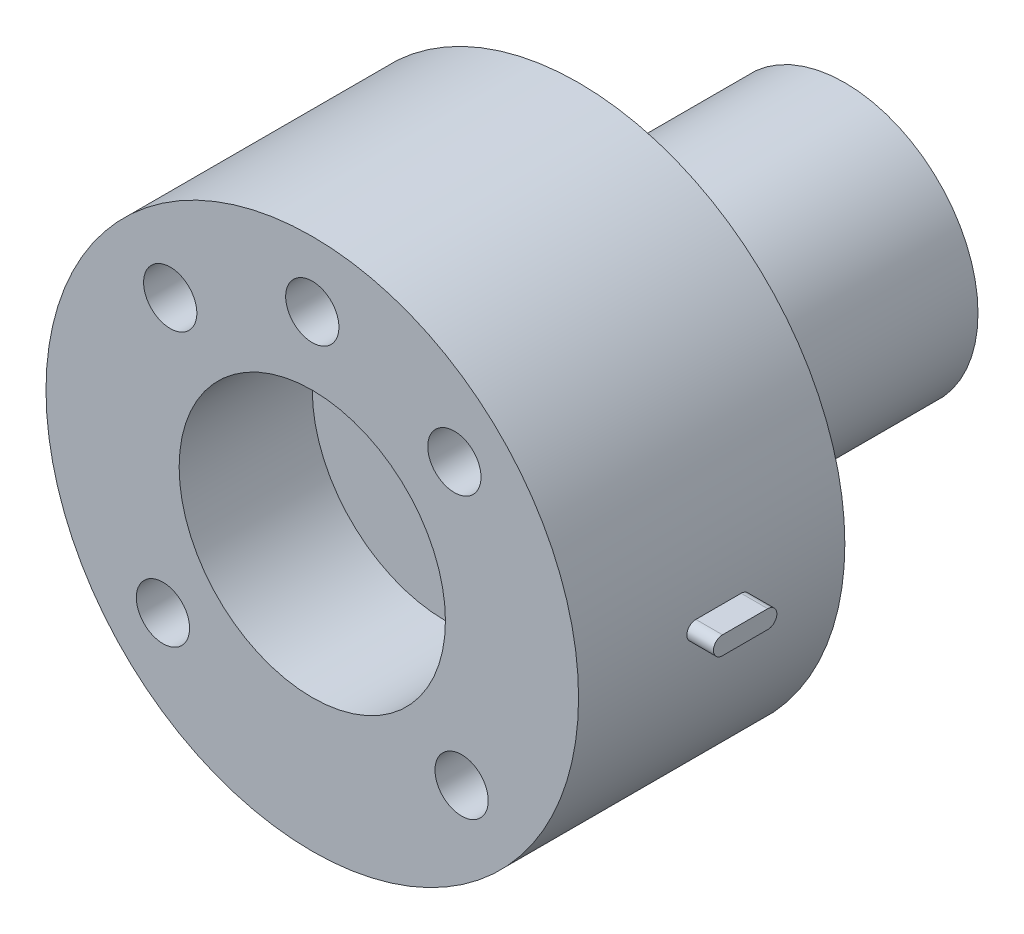
ISO-10303-21;
HEADER;
FILE_DESCRIPTION(('STEP AP214'),'2;1');
FILE_NAME('part.step','',(''),(''),'','','');
FILE_SCHEMA(('AUTOMOTIVE_DESIGN { 1 0 10303 214 1 1 1 1 }'));
ENDSEC;
DATA;
#1=APPLICATION_CONTEXT('core data for automotive mechanical design processes');
#2=APPLICATION_PROTOCOL_DEFINITION('international standard','automotive_design',2000,#1);
#3=PRODUCT_CONTEXT('',#1,'mechanical');
#4=PRODUCT('Part','Part','',(#3));
#5=PRODUCT_RELATED_PRODUCT_CATEGORY('part','',(#4));
#6=PRODUCT_DEFINITION_FORMATION('','',#4);
#7=PRODUCT_DEFINITION_CONTEXT('part definition',#1,'design');
#8=PRODUCT_DEFINITION('design','',#6,#7);
#9=PRODUCT_DEFINITION_SHAPE('','',#8);
#10=(LENGTH_UNIT() NAMED_UNIT(*) SI_UNIT(.MILLI.,.METRE.));
#11=(NAMED_UNIT(*) PLANE_ANGLE_UNIT() SI_UNIT($,.RADIAN.));
#12=(NAMED_UNIT(*) SI_UNIT($,.STERADIAN.) SOLID_ANGLE_UNIT());
#13=UNCERTAINTY_MEASURE_WITH_UNIT(LENGTH_MEASURE(1.E-05),#10,'distance_accuracy_value','');
#14=(GEOMETRIC_REPRESENTATION_CONTEXT(3) GLOBAL_UNCERTAINTY_ASSIGNED_CONTEXT((#13)) GLOBAL_UNIT_ASSIGNED_CONTEXT((#10,
#11,#12)) REPRESENTATION_CONTEXT('',''));
#15=CARTESIAN_POINT('',(0.,0.,0.));
#16=DIRECTION('',(0.,0.,1.));
#17=DIRECTION('',(1.,0.,0.));
#18=AXIS2_PLACEMENT_3D('',#15,#16,#17);
#19=CARTESIAN_POINT('',(22.,0.,11.1885137292465));
#20=DIRECTION('',(-1.,0.,0.));
#21=DIRECTION('',(0.,0.,1.));
#22=AXIS2_PLACEMENT_3D('',#19,#20,#21);
#23=CYLINDRICAL_SURFACE('',#22,0.679808429118636);
#24=CARTESIAN_POINT('',(20.,0.,11.1885137292465));
#25=DIRECTION('',(1.,0.,0.));
#26=DIRECTION('',(0.,0.,-1.));
#27=AXIS2_PLACEMENT_3D('',#24,#25,#26);
#28=CIRCLE('',#27,0.679808429118636);
#29=CARTESIAN_POINT('',(20.,0.679808429118636,11.1885137292465));
#30=VERTEX_POINT('',#29);
#31=CARTESIAN_POINT('',(20.,-0.679808429118636,11.1885137292465));
#32=VERTEX_POINT('',#31);
#33=EDGE_CURVE('E115',#30,#32,#28,.T.);
#34=ORIENTED_EDGE('',*,*,#33,.T.);
#35=DIRECTION('',(-1.,0.,0.));
#36=VECTOR('',#35,1.);
#37=CARTESIAN_POINT('',(22.,-0.679808429118636,11.1885137292465));
#38=LINE('',#37,#36);
#39=CARTESIAN_POINT('',(22.,-0.679808429118636,11.1885137292465));
#40=VERTEX_POINT('',#39);
#41=EDGE_CURVE('E12',#40,#32,#38,.T.);
#42=ORIENTED_EDGE('',*,*,#41,.F.);
#43=CARTESIAN_POINT('',(22.,0.,11.1885137292465));
#44=DIRECTION('',(1.,0.,0.));
#45=DIRECTION('',(0.,0.,-1.));
#46=AXIS2_PLACEMENT_3D('',#43,#44,#45);
#47=CIRCLE('',#46,0.679808429118636);
#48=CARTESIAN_POINT('',(22.,0.679808429118636,11.1885137292465));
#49=VERTEX_POINT('',#48);
#50=EDGE_CURVE('E103',#49,#40,#47,.T.);
#51=ORIENTED_EDGE('',*,*,#50,.F.);
#52=DIRECTION('',(-1.,0.,0.));
#53=VECTOR('',#52,1.);
#54=CARTESIAN_POINT('',(22.,0.679808429118636,11.1885137292465));
#55=LINE('',#54,#53);
#56=EDGE_CURVE('E111',#49,#30,#55,.T.);
#57=ORIENTED_EDGE('',*,*,#56,.T.);
#58=EDGE_LOOP('',(#34,#42,#51,#57));
#59=FACE_BOUND('',#58,.T.);
#60=ADVANCED_FACE('F52',(#59),#23,.T.);
#61=CARTESIAN_POINT('',(22.,-0.679808429118636,11.1885137292465));
#62=DIRECTION('',(0.,1.,0.));
#63=DIRECTION('',(0.,0.,1.));
#64=AXIS2_PLACEMENT_3D('',#61,#62,#63);
#65=PLANE('',#64);
#66=DIRECTION('',(0.,0.,-1.));
#67=VECTOR('',#66,1.);
#68=CARTESIAN_POINT('',(20.,-0.679808429118636,11.1885137292465));
#69=LINE('',#68,#67);
#70=CARTESIAN_POINT('',(20.,-0.679808429118636,7.78947158365262));
#71=VERTEX_POINT('',#70);
#72=EDGE_CURVE('E107',#32,#71,#69,.T.);
#73=ORIENTED_EDGE('',*,*,#72,.T.);
#74=DIRECTION('',(-1.,0.,0.));
#75=VECTOR('',#74,1.);
#76=CARTESIAN_POINT('',(22.,-0.679808429118636,7.78947158365262));
#77=LINE('',#76,#75);
#78=CARTESIAN_POINT('',(22.,-0.679808429118636,7.78947158365262));
#79=VERTEX_POINT('',#78);
#80=EDGE_CURVE('E60',#79,#71,#77,.T.);
#81=ORIENTED_EDGE('',*,*,#80,.F.);
#82=DIRECTION('',(0.,0.,-1.));
#83=VECTOR('',#82,1.);
#84=CARTESIAN_POINT('',(22.,-0.679808429118636,11.1885137292465));
#85=LINE('',#84,#83);
#86=EDGE_CURVE('E98',#40,#79,#85,.T.);
#87=ORIENTED_EDGE('',*,*,#86,.F.);
#88=ORIENTED_EDGE('',*,*,#41,.T.);
#89=EDGE_LOOP('',(#73,#81,#87,#88));
#90=FACE_BOUND('',#89,.T.);
#91=ADVANCED_FACE('F106',(#90),#65,.F.);
#92=CARTESIAN_POINT('',(22.,0.,7.78947158365262));
#93=DIRECTION('',(-1.,0.,0.));
#94=DIRECTION('',(0.,0.,1.));
#95=AXIS2_PLACEMENT_3D('',#92,#93,#94);
#96=CYLINDRICAL_SURFACE('',#95,0.679808429118636);
#97=CARTESIAN_POINT('',(20.,0.,7.78947158365262));
#98=DIRECTION('',(1.,0.,0.));
#99=DIRECTION('',(0.,0.,-1.));
#100=AXIS2_PLACEMENT_3D('',#97,#98,#99);
#101=CIRCLE('',#100,0.679808429118636);
#102=CARTESIAN_POINT('',(20.,0.679808429118636,7.78947158365262));
#103=VERTEX_POINT('',#102);
#104=EDGE_CURVE('E85',#71,#103,#101,.T.);
#105=ORIENTED_EDGE('',*,*,#104,.T.);
#106=DIRECTION('',(-1.,0.,0.));
#107=VECTOR('',#106,1.);
#108=CARTESIAN_POINT('',(22.,0.679808429118636,7.78947158365262));
#109=LINE('',#108,#107);
#110=CARTESIAN_POINT('',(22.,0.679808429118636,7.78947158365262));
#111=VERTEX_POINT('',#110);
#112=EDGE_CURVE('E108',#111,#103,#109,.T.);
#113=ORIENTED_EDGE('',*,*,#112,.F.);
#114=CARTESIAN_POINT('',(22.,0.,7.78947158365262));
#115=DIRECTION('',(1.,0.,0.));
#116=DIRECTION('',(0.,0.,-1.));
#117=AXIS2_PLACEMENT_3D('',#114,#115,#116);
#118=CIRCLE('',#117,0.679808429118636);
#119=EDGE_CURVE('E101',#79,#111,#118,.T.);
#120=ORIENTED_EDGE('',*,*,#119,.F.);
#121=ORIENTED_EDGE('',*,*,#80,.T.);
#122=EDGE_LOOP('',(#105,#113,#120,#121));
#123=FACE_BOUND('',#122,.T.);
#124=ADVANCED_FACE('F109',(#123),#96,.T.);
#125=CARTESIAN_POINT('',(22.,0.679808429118636,11.1885137292465));
#126=DIRECTION('',(0.,-1.,0.));
#127=DIRECTION('',(0.,0.,-1.));
#128=AXIS2_PLACEMENT_3D('',#125,#126,#127);
#129=PLANE('',#128);
#130=DIRECTION('',(0.,0.,1.));
#131=VECTOR('',#130,1.);
#132=CARTESIAN_POINT('',(20.,0.679808429118636,11.1885137292465));
#133=LINE('',#132,#131);
#134=EDGE_CURVE('E91',#103,#30,#133,.T.);
#135=ORIENTED_EDGE('',*,*,#134,.T.);
#136=ORIENTED_EDGE('',*,*,#56,.F.);
#137=DIRECTION('',(0.,0.,1.));
#138=VECTOR('',#137,1.);
#139=CARTESIAN_POINT('',(22.,0.679808429118636,11.1885137292465));
#140=LINE('',#139,#138);
#141=EDGE_CURVE('E68',#111,#49,#140,.T.);
#142=ORIENTED_EDGE('',*,*,#141,.F.);
#143=ORIENTED_EDGE('',*,*,#112,.T.);
#144=EDGE_LOOP('',(#135,#136,#142,#143));
#145=FACE_BOUND('',#144,.T.);
#146=ADVANCED_FACE('F122',(#145),#129,.F.);
#147=CARTESIAN_POINT('',(22.,0.,11.1885137292465));
#148=DIRECTION('',(1.,0.,0.));
#149=DIRECTION('',(0.,0.,-1.));
#150=AXIS2_PLACEMENT_3D('',#147,#148,#149);
#151=PLANE('',#150);
#152=ORIENTED_EDGE('',*,*,#50,.T.);
#153=ORIENTED_EDGE('',*,*,#86,.T.);
#154=ORIENTED_EDGE('',*,*,#119,.T.);
#155=ORIENTED_EDGE('',*,*,#141,.T.);
#156=EDGE_LOOP('',(#152,#153,#154,#155));
#157=FACE_BOUND('',#156,.T.);
#158=ADVANCED_FACE('F99',(#157),#151,.T.);
#159=CARTESIAN_POINT('',(20.,0.,11.1885137292465));
#160=DIRECTION('',(1.,0.,0.));
#161=DIRECTION('',(0.,0.,-1.));
#162=AXIS2_PLACEMENT_3D('',#159,#160,#161);
#163=PLANE('',#162);
#164=ORIENTED_EDGE('',*,*,#33,.F.);
#165=ORIENTED_EDGE('',*,*,#134,.F.);
#166=ORIENTED_EDGE('',*,*,#104,.F.);
#167=ORIENTED_EDGE('',*,*,#72,.F.);
#168=EDGE_LOOP('',(#164,#165,#166,#167));
#169=FACE_BOUND('',#168,.T.);
#170=ADVANCED_FACE('F125',(#169),#163,.F.);
#171=CLOSED_SHELL('',(#60,#91,#124,#146,#158,#170));
#172=MANIFOLD_SOLID_BREP('B2',#171);
#173=CARTESIAN_POINT('',(0.,0.,20.));
#174=DIRECTION('',(0.,0.,-1.));
#175=DIRECTION('',(-1.,0.,0.));
#176=AXIS2_PLACEMENT_3D('',#173,#174,#175);
#177=CYLINDRICAL_SURFACE('',#176,20.);
#178=CARTESIAN_POINT('',(0.,0.,20.));
#179=DIRECTION('',(0.,0.,1.));
#180=DIRECTION('',(1.,0.,0.));
#181=AXIS2_PLACEMENT_3D('',#178,#179,#180);
#182=CIRCLE('',#181,20.);
#183=CARTESIAN_POINT('',(20.,0.,20.));
#184=VERTEX_POINT('',#183);
#185=EDGE_CURVE('E195',#184,#184,#182,.T.);
#186=ORIENTED_EDGE('',*,*,#185,.F.);
#187=EDGE_LOOP('',(#186));
#188=FACE_BOUND('',#187,.T.);
#189=CARTESIAN_POINT('',(0.,0.,0.));
#190=DIRECTION('',(0.,0.,1.));
#191=DIRECTION('',(1.,0.,0.));
#192=AXIS2_PLACEMENT_3D('',#189,#190,#191);
#193=CIRCLE('',#192,20.);
#194=CARTESIAN_POINT('',(20.,0.,0.));
#195=VERTEX_POINT('',#194);
#196=EDGE_CURVE('E190',#195,#195,#193,.T.);
#197=ORIENTED_EDGE('',*,*,#196,.T.);
#198=EDGE_LOOP('',(#197));
#199=FACE_BOUND('',#198,.T.);
#200=ADVANCED_FACE('F187',(#188,#199),#177,.T.);
#201=CARTESIAN_POINT('',(0.,0.,20.));
#202=DIRECTION('',(0.,0.,1.));
#203=DIRECTION('',(1.,0.,0.));
#204=AXIS2_PLACEMENT_3D('',#201,#202,#203);
#205=PLANE('',#204);
#206=CARTESIAN_POINT('',(0.,15.0911103529324,20.));
#207=DIRECTION('',(0.,0.,1.));
#208=DIRECTION('',(1.,0.,0.));
#209=AXIS2_PLACEMENT_3D('',#206,#207,#208);
#210=CIRCLE('',#209,2.);
#211=CARTESIAN_POINT('',(2.,15.0911103529324,20.));
#212=VERTEX_POINT('',#211);
#213=EDGE_CURVE('E232',#212,#212,#210,.T.);
#214=ORIENTED_EDGE('',*,*,#213,.F.);
#215=EDGE_LOOP('',(#214));
#216=FACE_BOUND('',#215,.T.);
#217=CARTESIAN_POINT('',(-10.6710264661982,10.6710264661981,20.));
#218=DIRECTION('',(0.,0.,1.));
#219=DIRECTION('',(-1.,0.,0.));
#220=AXIS2_PLACEMENT_3D('',#217,#218,#219);
#221=CIRCLE('',#220,1.99999999999787);
#222=CARTESIAN_POINT('',(-12.671026466196,10.6710264661981,20.));
#223=VERTEX_POINT('',#222);
#224=EDGE_CURVE('E237',#223,#223,#221,.T.);
#225=ORIENTED_EDGE('',*,*,#224,.F.);
#226=EDGE_LOOP('',(#225));
#227=FACE_BOUND('',#226,.T.);
#228=CARTESIAN_POINT('',(11.2148805694928,-10.0979238210887,20.));
#229=DIRECTION('',(0.,0.,1.));
#230=DIRECTION('',(1.,0.,0.));
#231=AXIS2_PLACEMENT_3D('',#228,#229,#230);
#232=CIRCLE('',#231,1.99999999999888);
#233=CARTESIAN_POINT('',(13.2148805694917,-10.0979238210887,20.));
#234=VERTEX_POINT('',#233);
#235=EDGE_CURVE('E220',#234,#234,#232,.T.);
#236=ORIENTED_EDGE('',*,*,#235,.F.);
#237=EDGE_LOOP('',(#236));
#238=FACE_BOUND('',#237,.T.);
#239=CARTESIAN_POINT('',(10.6710264661982,10.6710264661981,20.));
#240=DIRECTION('',(0.,0.,1.));
#241=DIRECTION('',(1.,0.,0.));
#242=AXIS2_PLACEMENT_3D('',#239,#240,#241);
#243=CIRCLE('',#242,1.99999999999787);
#244=CARTESIAN_POINT('',(12.671026466196,10.6710264661981,20.));
#245=VERTEX_POINT('',#244);
#246=EDGE_CURVE('E219',#245,#245,#243,.T.);
#247=ORIENTED_EDGE('',*,*,#246,.F.);
#248=EDGE_LOOP('',(#247));
#249=FACE_BOUND('',#248,.T.);
#250=CARTESIAN_POINT('',(-11.2148805694928,-10.0979238210887,20.));
#251=DIRECTION('',(0.,0.,1.));
#252=DIRECTION('',(-1.,0.,0.));
#253=AXIS2_PLACEMENT_3D('',#250,#251,#252);
#254=CIRCLE('',#253,1.99999999999888);
#255=CARTESIAN_POINT('',(-13.2148805694917,-10.0979238210887,20.));
#256=VERTEX_POINT('',#255);
#257=EDGE_CURVE('E228',#256,#256,#254,.T.);
#258=ORIENTED_EDGE('',*,*,#257,.F.);
#259=EDGE_LOOP('',(#258));
#260=FACE_BOUND('',#259,.T.);
#261=CARTESIAN_POINT('',(0.,0.,20.));
#262=DIRECTION('',(0.,0.,1.));
#263=DIRECTION('',(1.,0.,0.));
#264=AXIS2_PLACEMENT_3D('',#261,#262,#263);
#265=CIRCLE('',#264,10.);
#266=CARTESIAN_POINT('',(10.,0.,20.));
#267=VERTEX_POINT('',#266);
#268=EDGE_CURVE('E207',#267,#267,#265,.T.);
#269=ORIENTED_EDGE('',*,*,#268,.F.);
#270=EDGE_LOOP('',(#269));
#271=FACE_BOUND('',#270,.T.);
#272=ORIENTED_EDGE('',*,*,#185,.T.);
#273=EDGE_LOOP('',(#272));
#274=FACE_BOUND('',#273,.T.);
#275=ADVANCED_FACE('F264',(#216,#227,#238,#249,#260,#271,#274),#205,.T.);
#276=CARTESIAN_POINT('',(0.,0.,0.));
#277=DIRECTION('',(0.,0.,1.));
#278=DIRECTION('',(1.,0.,0.));
#279=AXIS2_PLACEMENT_3D('',#276,#277,#278);
#280=PLANE('',#279);
#281=CARTESIAN_POINT('',(0.,0.,0.));
#282=DIRECTION('',(0.,0.,-1.));
#283=DIRECTION('',(-1.,0.,0.));
#284=AXIS2_PLACEMENT_3D('',#281,#282,#283);
#285=CIRCLE('',#284,10.);
#286=CARTESIAN_POINT('',(-10.,0.,0.));
#287=VERTEX_POINT('',#286);
#288=EDGE_CURVE('E51',#287,#287,#285,.T.);
#289=ORIENTED_EDGE('',*,*,#288,.F.);
#290=EDGE_LOOP('',(#289));
#291=FACE_BOUND('',#290,.T.);
#292=ORIENTED_EDGE('',*,*,#196,.F.);
#293=EDGE_LOOP('',(#292));
#294=FACE_BOUND('',#293,.T.);
#295=ADVANCED_FACE('F267',(#291,#294),#280,.F.);
#296=CARTESIAN_POINT('',(0.,0.,-20.));
#297=DIRECTION('',(0.,0.,1.));
#298=DIRECTION('',(1.,0.,0.));
#299=AXIS2_PLACEMENT_3D('',#296,#297,#298);
#300=CYLINDRICAL_SURFACE('',#299,10.);
#301=CARTESIAN_POINT('',(0.,0.,-20.));
#302=DIRECTION('',(0.,0.,-1.));
#303=DIRECTION('',(-1.,0.,0.));
#304=AXIS2_PLACEMENT_3D('',#301,#302,#303);
#305=CIRCLE('',#304,10.);
#306=CARTESIAN_POINT('',(-10.,0.,-20.));
#307=VERTEX_POINT('',#306);
#308=EDGE_CURVE('E202',#307,#307,#305,.T.);
#309=ORIENTED_EDGE('',*,*,#308,.F.);
#310=EDGE_LOOP('',(#309));
#311=FACE_BOUND('',#310,.T.);
#312=ORIENTED_EDGE('',*,*,#288,.T.);
#313=EDGE_LOOP('',(#312));
#314=FACE_BOUND('',#313,.T.);
#315=ADVANCED_FACE('F288',(#311,#314),#300,.T.);
#316=CARTESIAN_POINT('',(0.,0.,-20.));
#317=DIRECTION('',(0.,0.,-1.));
#318=DIRECTION('',(-1.,0.,0.));
#319=AXIS2_PLACEMENT_3D('',#316,#317,#318);
#320=PLANE('',#319);
#321=ORIENTED_EDGE('',*,*,#308,.T.);
#322=EDGE_LOOP('',(#321));
#323=FACE_BOUND('',#322,.T.);
#324=ADVANCED_FACE('F293',(#323),#320,.T.);
#325=CARTESIAN_POINT('',(0.,0.,10.));
#326=DIRECTION('',(0.,0.,1.));
#327=DIRECTION('',(1.,0.,0.));
#328=AXIS2_PLACEMENT_3D('',#325,#326,#327);
#329=CYLINDRICAL_SURFACE('',#328,10.);
#330=CARTESIAN_POINT('',(0.,0.,10.));
#331=DIRECTION('',(0.,0.,1.));
#332=DIRECTION('',(1.,0.,0.));
#333=AXIS2_PLACEMENT_3D('',#330,#331,#332);
#334=CIRCLE('',#333,10.);
#335=CARTESIAN_POINT('',(10.,0.,10.));
#336=VERTEX_POINT('',#335);
#337=EDGE_CURVE('E206',#336,#336,#334,.T.);
#338=ORIENTED_EDGE('',*,*,#337,.F.);
#339=EDGE_LOOP('',(#338));
#340=FACE_BOUND('',#339,.T.);
#341=ORIENTED_EDGE('',*,*,#268,.T.);
#342=EDGE_LOOP('',(#341));
#343=FACE_BOUND('',#342,.T.);
#344=ADVANCED_FACE('F299',(#340,#343),#329,.F.);
#345=CARTESIAN_POINT('',(0.,0.,10.));
#346=DIRECTION('',(0.,0.,1.));
#347=DIRECTION('',(1.,0.,0.));
#348=AXIS2_PLACEMENT_3D('',#345,#346,#347);
#349=PLANE('',#348);
#350=ORIENTED_EDGE('',*,*,#337,.T.);
#351=EDGE_LOOP('',(#350));
#352=FACE_BOUND('',#351,.T.);
#353=ADVANCED_FACE('F303',(#352),#349,.T.);
#354=CARTESIAN_POINT('',(-11.2148805694928,-10.0979238210887,15.));
#355=DIRECTION('',(0.,0.,1.));
#356=DIRECTION('',(1.,0.,0.));
#357=AXIS2_PLACEMENT_3D('',#354,#355,#356);
#358=CYLINDRICAL_SURFACE('',#357,1.99999999999888);
#359=CARTESIAN_POINT('',(-11.2148805694928,-10.0979238210887,15.));
#360=DIRECTION('',(0.,0.,1.));
#361=DIRECTION('',(-1.,0.,0.));
#362=AXIS2_PLACEMENT_3D('',#359,#360,#361);
#363=CIRCLE('',#362,1.99999999999888);
#364=CARTESIAN_POINT('',(-13.2148805694917,-10.0979238210887,15.));
#365=VERTEX_POINT('',#364);
#366=EDGE_CURVE('E224',#365,#365,#363,.T.);
#367=ORIENTED_EDGE('',*,*,#366,.F.);
#368=EDGE_LOOP('',(#367));
#369=FACE_BOUND('',#368,.T.);
#370=ORIENTED_EDGE('',*,*,#257,.T.);
#371=EDGE_LOOP('',(#370));
#372=FACE_BOUND('',#371,.T.);
#373=ADVANCED_FACE('F307',(#369,#372),#358,.F.);
#374=CARTESIAN_POINT('',(-11.2148805694928,-10.0979238210887,15.));
#375=DIRECTION('',(0.,0.,-1.));
#376=DIRECTION('',(-1.,0.,0.));
#377=AXIS2_PLACEMENT_3D('',#374,#375,#376);
#378=PLANE('',#377);
#379=ORIENTED_EDGE('',*,*,#366,.T.);
#380=EDGE_LOOP('',(#379));
#381=FACE_BOUND('',#380,.T.);
#382=ADVANCED_FACE('F317',(#381),#378,.F.);
#383=CARTESIAN_POINT('',(10.6710264661982,10.6710264661981,15.));
#384=DIRECTION('',(0.,0.,1.));
#385=DIRECTION('',(1.,0.,0.));
#386=AXIS2_PLACEMENT_3D('',#383,#384,#385);
#387=CYLINDRICAL_SURFACE('',#386,1.99999999999787);
#388=CARTESIAN_POINT('',(10.6710264661982,10.6710264661981,15.));
#389=DIRECTION('',(0.,0.,1.));
#390=DIRECTION('',(1.,0.,0.));
#391=AXIS2_PLACEMENT_3D('',#388,#389,#390);
#392=CIRCLE('',#391,1.99999999999787);
#393=CARTESIAN_POINT('',(12.671026466196,10.6710264661981,15.));
#394=VERTEX_POINT('',#393);
#395=EDGE_CURVE('E215',#394,#394,#392,.T.);
#396=ORIENTED_EDGE('',*,*,#395,.F.);
#397=EDGE_LOOP('',(#396));
#398=FACE_BOUND('',#397,.T.);
#399=ORIENTED_EDGE('',*,*,#246,.T.);
#400=EDGE_LOOP('',(#399));
#401=FACE_BOUND('',#400,.T.);
#402=ADVANCED_FACE('F313',(#398,#401),#387,.F.);
#403=CARTESIAN_POINT('',(10.6710264661982,10.6710264661981,15.));
#404=DIRECTION('',(0.,0.,1.));
#405=DIRECTION('',(1.,0.,0.));
#406=AXIS2_PLACEMENT_3D('',#403,#404,#405);
#407=PLANE('',#406);
#408=ORIENTED_EDGE('',*,*,#395,.T.);
#409=EDGE_LOOP('',(#408));
#410=FACE_BOUND('',#409,.T.);
#411=ADVANCED_FACE('F309',(#410),#407,.T.);
#412=CARTESIAN_POINT('',(11.2148805694928,-10.0979238210887,15.));
#413=DIRECTION('',(0.,0.,1.));
#414=DIRECTION('',(1.,0.,0.));
#415=AXIS2_PLACEMENT_3D('',#412,#413,#414);
#416=CYLINDRICAL_SURFACE('',#415,1.99999999999888);
#417=CARTESIAN_POINT('',(11.2148805694928,-10.0979238210887,15.));
#418=DIRECTION('',(0.,0.,1.));
#419=DIRECTION('',(1.,0.,0.));
#420=AXIS2_PLACEMENT_3D('',#417,#418,#419);
#421=CIRCLE('',#420,1.99999999999888);
#422=CARTESIAN_POINT('',(13.2148805694917,-10.0979238210887,15.));
#423=VERTEX_POINT('',#422);
#424=EDGE_CURVE('E241',#423,#423,#421,.T.);
#425=ORIENTED_EDGE('',*,*,#424,.F.);
#426=EDGE_LOOP('',(#425));
#427=FACE_BOUND('',#426,.T.);
#428=ORIENTED_EDGE('',*,*,#235,.T.);
#429=EDGE_LOOP('',(#428));
#430=FACE_BOUND('',#429,.T.);
#431=ADVANCED_FACE('F312',(#427,#430),#416,.F.);
#432=CARTESIAN_POINT('',(11.2148805694928,-10.0979238210887,15.));
#433=DIRECTION('',(0.,0.,1.));
#434=DIRECTION('',(1.,0.,0.));
#435=AXIS2_PLACEMENT_3D('',#432,#433,#434);
#436=PLANE('',#435);
#437=ORIENTED_EDGE('',*,*,#424,.T.);
#438=EDGE_LOOP('',(#437));
#439=FACE_BOUND('',#438,.T.);
#440=ADVANCED_FACE('F331',(#439),#436,.T.);
#441=CARTESIAN_POINT('',(-10.6710264661982,10.6710264661981,15.));
#442=DIRECTION('',(0.,0.,1.));
#443=DIRECTION('',(1.,0.,0.));
#444=AXIS2_PLACEMENT_3D('',#441,#442,#443);
#445=CYLINDRICAL_SURFACE('',#444,1.99999999999787);
#446=CARTESIAN_POINT('',(-10.6710264661982,10.6710264661981,15.));
#447=DIRECTION('',(0.,0.,1.));
#448=DIRECTION('',(-1.,0.,0.));
#449=AXIS2_PLACEMENT_3D('',#446,#447,#448);
#450=CIRCLE('',#449,1.99999999999787);
#451=CARTESIAN_POINT('',(-12.671026466196,10.6710264661981,15.));
#452=VERTEX_POINT('',#451);
#453=EDGE_CURVE('E233',#452,#452,#450,.T.);
#454=ORIENTED_EDGE('',*,*,#453,.F.);
#455=EDGE_LOOP('',(#454));
#456=FACE_BOUND('',#455,.T.);
#457=ORIENTED_EDGE('',*,*,#224,.T.);
#458=EDGE_LOOP('',(#457));
#459=FACE_BOUND('',#458,.T.);
#460=ADVANCED_FACE('F327',(#456,#459),#445,.F.);
#461=CARTESIAN_POINT('',(-10.6710264661982,10.6710264661981,15.));
#462=DIRECTION('',(0.,0.,-1.));
#463=DIRECTION('',(-1.,0.,0.));
#464=AXIS2_PLACEMENT_3D('',#461,#462,#463);
#465=PLANE('',#464);
#466=ORIENTED_EDGE('',*,*,#453,.T.);
#467=EDGE_LOOP('',(#466));
#468=FACE_BOUND('',#467,.T.);
#469=ADVANCED_FACE('F260',(#468),#465,.F.);
#470=CARTESIAN_POINT('',(0.,15.0911103529324,15.));
#471=DIRECTION('',(0.,0.,1.));
#472=DIRECTION('',(1.,0.,0.));
#473=AXIS2_PLACEMENT_3D('',#470,#471,#472);
#474=CYLINDRICAL_SURFACE('',#473,2.);
#475=CARTESIAN_POINT('',(0.,15.0911103529324,15.));
#476=DIRECTION('',(0.,0.,1.));
#477=DIRECTION('',(1.,0.,0.));
#478=AXIS2_PLACEMENT_3D('',#475,#476,#477);
#479=CIRCLE('',#478,2.);
#480=CARTESIAN_POINT('',(2.,15.0911103529324,15.));
#481=VERTEX_POINT('',#480);
#482=EDGE_CURVE('E211',#481,#481,#479,.T.);
#483=ORIENTED_EDGE('',*,*,#482,.F.);
#484=EDGE_LOOP('',(#483));
#485=FACE_BOUND('',#484,.T.);
#486=ORIENTED_EDGE('',*,*,#213,.T.);
#487=EDGE_LOOP('',(#486));
#488=FACE_BOUND('',#487,.T.);
#489=ADVANCED_FACE('F257',(#485,#488),#474,.F.);
#490=CARTESIAN_POINT('',(0.,15.0911103529324,15.));
#491=DIRECTION('',(0.,0.,1.));
#492=DIRECTION('',(1.,0.,0.));
#493=AXIS2_PLACEMENT_3D('',#490,#491,#492);
#494=PLANE('',#493);
#495=ORIENTED_EDGE('',*,*,#482,.T.);
#496=EDGE_LOOP('',(#495));
#497=FACE_BOUND('',#496,.T.);
#498=ADVANCED_FACE('F255',(#497),#494,.T.);
#499=CLOSED_SHELL('',(#200,#275,#295,#315,#324,#344,#353,#373,#382,#402,#411,#431,#440,#460,
#469,#489,#498));
#500=MANIFOLD_SOLID_BREP('B6',#499);
#501=ADVANCED_BREP_SHAPE_REPRESENTATION('',(#18,#172,#500),#14);
#502=SHAPE_DEFINITION_REPRESENTATION(#9,#501);
ENDSEC;
END-ISO-10303-21;
